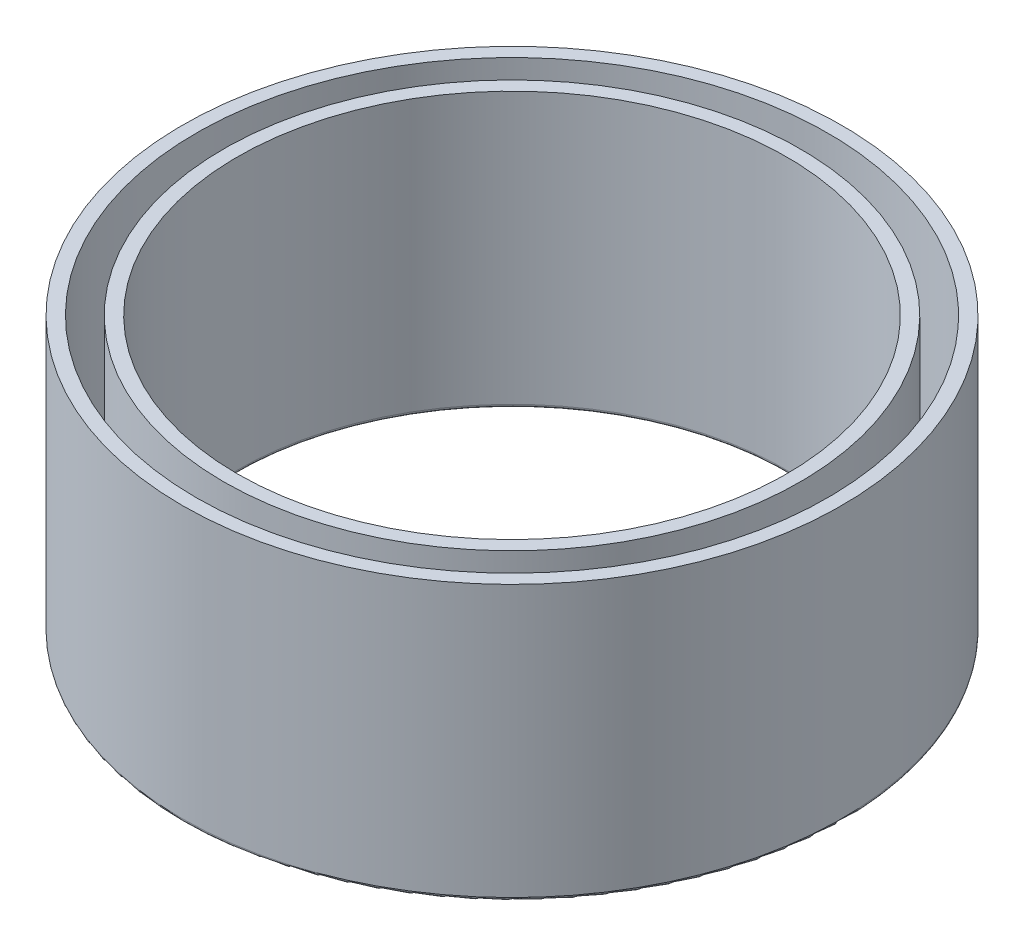
ISO-10303-21;
HEADER;
FILE_DESCRIPTION(('STEP AP214'),'2;1');
FILE_NAME('part.step','',(''),(''),'','','');
FILE_SCHEMA(('AUTOMOTIVE_DESIGN { 1 0 10303 214 1 1 1 1 }'));
ENDSEC;
DATA;
#1=APPLICATION_CONTEXT('core data for automotive mechanical design processes');
#2=APPLICATION_PROTOCOL_DEFINITION('international standard','automotive_design',2000,#1);
#3=PRODUCT_CONTEXT('',#1,'mechanical');
#4=PRODUCT('Part','Part','',(#3));
#5=PRODUCT_RELATED_PRODUCT_CATEGORY('part','',(#4));
#6=PRODUCT_DEFINITION_FORMATION('','',#4);
#7=PRODUCT_DEFINITION_CONTEXT('part definition',#1,'design');
#8=PRODUCT_DEFINITION('design','',#6,#7);
#9=PRODUCT_DEFINITION_SHAPE('','',#8);
#10=(LENGTH_UNIT() NAMED_UNIT(*) SI_UNIT(.MILLI.,.METRE.));
#11=(NAMED_UNIT(*) PLANE_ANGLE_UNIT() SI_UNIT($,.RADIAN.));
#12=(NAMED_UNIT(*) SI_UNIT($,.STERADIAN.) SOLID_ANGLE_UNIT());
#13=UNCERTAINTY_MEASURE_WITH_UNIT(LENGTH_MEASURE(1.E-05),#10,'distance_accuracy_value','');
#14=(GEOMETRIC_REPRESENTATION_CONTEXT(3) GLOBAL_UNCERTAINTY_ASSIGNED_CONTEXT((#13)) GLOBAL_UNIT_ASSIGNED_CONTEXT((#10,
#11,#12)) REPRESENTATION_CONTEXT('',''));
#15=CARTESIAN_POINT('',(0.,0.,0.));
#16=DIRECTION('',(0.,0.,1.));
#17=DIRECTION('',(1.,0.,0.));
#18=AXIS2_PLACEMENT_3D('',#15,#16,#17);
#19=CARTESIAN_POINT('',(0.,0.,0.));
#20=DIRECTION('',(0.,1.,0.));
#21=DIRECTION('',(0.,0.,1.));
#22=AXIS2_PLACEMENT_3D('',#19,#20,#21);
#23=PLANE('',#22);
#24=CARTESIAN_POINT('',(0.,0.,0.));
#25=DIRECTION('',(0.,1.,0.));
#26=DIRECTION('',(0.,0.,1.));
#27=AXIS2_PLACEMENT_3D('',#24,#25,#26);
#28=CIRCLE('',#27,20.);
#29=CARTESIAN_POINT('',(0.,0.,20.));
#30=VERTEX_POINT('',#29);
#31=EDGE_CURVE('E60',#30,#30,#28,.T.);
#32=ORIENTED_EDGE('',*,*,#31,.F.);
#33=EDGE_LOOP('',(#32));
#34=FACE_BOUND('',#33,.T.);
#35=CARTESIAN_POINT('',(0.,0.,0.));
#36=DIRECTION('',(0.,1.,0.));
#37=DIRECTION('',(0.,0.,1.));
#38=AXIS2_PLACEMENT_3D('',#35,#36,#37);
#39=CIRCLE('',#38,21.);
#40=CARTESIAN_POINT('',(0.,0.,21.));
#41=VERTEX_POINT('',#40);
#42=EDGE_CURVE('E64',#41,#41,#39,.T.);
#43=ORIENTED_EDGE('',*,*,#42,.T.);
#44=EDGE_LOOP('',(#43));
#45=FACE_BOUND('',#44,.T.);
#46=ADVANCED_FACE('F37',(#34,#45),#23,.T.);
#47=CARTESIAN_POINT('',(0.,-20.,0.));
#48=DIRECTION('',(0.,1.,0.));
#49=DIRECTION('',(0.,0.,1.));
#50=AXIS2_PLACEMENT_3D('',#47,#48,#49);
#51=CYLINDRICAL_SURFACE('',#50,24.);
#52=CARTESIAN_POINT('',(0.,-19.75,0.));
#53=DIRECTION('',(0.,1.,0.));
#54=DIRECTION('',(0.,0.,1.));
#55=AXIS2_PLACEMENT_3D('',#52,#53,#54);
#56=CIRCLE('',#55,24.);
#57=CARTESIAN_POINT('',(0.,-19.75,24.));
#58=VERTEX_POINT('',#57);
#59=EDGE_CURVE('E44',#58,#58,#56,.T.);
#60=ORIENTED_EDGE('',*,*,#59,.T.);
#61=EDGE_LOOP('',(#60));
#62=FACE_BOUND('',#61,.T.);
#63=CARTESIAN_POINT('',(0.,0.,0.));
#64=DIRECTION('',(0.,1.,0.));
#65=DIRECTION('',(0.,0.,1.));
#66=AXIS2_PLACEMENT_3D('',#63,#64,#65);
#67=CIRCLE('',#66,24.);
#68=CARTESIAN_POINT('',(0.,0.,24.));
#69=VERTEX_POINT('',#68);
#70=EDGE_CURVE('E57',#69,#69,#67,.T.);
#71=ORIENTED_EDGE('',*,*,#70,.F.);
#72=EDGE_LOOP('',(#71));
#73=FACE_BOUND('',#72,.T.);
#74=ADVANCED_FACE('F92',(#62,#73),#51,.T.);
#75=CARTESIAN_POINT('',(0.,-20.,0.));
#76=DIRECTION('',(0.,1.,0.));
#77=DIRECTION('',(0.,0.,1.));
#78=AXIS2_PLACEMENT_3D('',#75,#76,#77);
#79=PLANE('',#78);
#80=CARTESIAN_POINT('',(0.,-20.,0.));
#81=DIRECTION('',(0.,1.,0.));
#82=DIRECTION('',(0.,0.,1.));
#83=AXIS2_PLACEMENT_3D('',#80,#81,#82);
#84=CIRCLE('',#83,23.75);
#85=CARTESIAN_POINT('',(0.,-20.,23.75));
#86=VERTEX_POINT('',#85);
#87=EDGE_CURVE('E10',#86,#86,#84,.F.);
#88=ORIENTED_EDGE('',*,*,#87,.T.);
#89=EDGE_LOOP('',(#88));
#90=FACE_BOUND('',#89,.T.);
#91=CARTESIAN_POINT('',(0.,-20.,0.));
#92=DIRECTION('',(0.,1.,0.));
#93=DIRECTION('',(0.,0.,1.));
#94=AXIS2_PLACEMENT_3D('',#91,#92,#93);
#95=CIRCLE('',#94,20.25);
#96=CARTESIAN_POINT('',(0.,-20.,20.25));
#97=VERTEX_POINT('',#96);
#98=EDGE_CURVE('E52',#97,#97,#95,.T.);
#99=ORIENTED_EDGE('',*,*,#98,.T.);
#100=EDGE_LOOP('',(#99));
#101=FACE_BOUND('',#100,.T.);
#102=ADVANCED_FACE('F88',(#90,#101),#79,.F.);
#103=CARTESIAN_POINT('',(0.,0.,0.));
#104=DIRECTION('',(0.,1.,0.));
#105=DIRECTION('',(0.,0.,1.));
#106=AXIS2_PLACEMENT_3D('',#103,#104,#105);
#107=CIRCLE('',#106,23.);
#108=CARTESIAN_POINT('',(0.,0.,23.));
#109=VERTEX_POINT('',#108);
#110=EDGE_CURVE('E68',#109,#109,#107,.T.);
#111=ORIENTED_EDGE('',*,*,#110,.F.);
#112=EDGE_LOOP('',(#111));
#113=FACE_BOUND('',#112,.T.);
#114=ORIENTED_EDGE('',*,*,#70,.T.);
#115=EDGE_LOOP('',(#114));
#116=FACE_BOUND('',#115,.T.);
#117=ADVANCED_FACE('F85',(#113,#116),#23,.T.);
#118=CARTESIAN_POINT('',(0.,-20.,0.));
#119=DIRECTION('',(0.,1.,0.));
#120=DIRECTION('',(0.,0.,1.));
#121=AXIS2_PLACEMENT_3D('',#118,#119,#120);
#122=CYLINDRICAL_SURFACE('',#121,20.);
#123=CARTESIAN_POINT('',(0.,-19.75,0.));
#124=DIRECTION('',(0.,1.,0.));
#125=DIRECTION('',(0.,0.,1.));
#126=AXIS2_PLACEMENT_3D('',#123,#124,#125);
#127=CIRCLE('',#126,20.);
#128=CARTESIAN_POINT('',(0.,-19.75,20.));
#129=VERTEX_POINT('',#128);
#130=EDGE_CURVE('E48',#129,#129,#127,.F.);
#131=ORIENTED_EDGE('',*,*,#130,.T.);
#132=EDGE_LOOP('',(#131));
#133=FACE_BOUND('',#132,.T.);
#134=ORIENTED_EDGE('',*,*,#31,.T.);
#135=EDGE_LOOP('',(#134));
#136=FACE_BOUND('',#135,.T.);
#137=ADVANCED_FACE('F81',(#133,#136),#122,.F.);
#138=CARTESIAN_POINT('',(0.,-20.,0.));
#139=DIRECTION('',(0.,1.,0.));
#140=DIRECTION('',(0.,0.,1.));
#141=AXIS2_PLACEMENT_3D('',#138,#139,#140);
#142=CYLINDRICAL_SURFACE('',#141,23.);
#143=CARTESIAN_POINT('',(0.,-19.,0.));
#144=DIRECTION('',(0.,1.,0.));
#145=DIRECTION('',(0.,0.,1.));
#146=AXIS2_PLACEMENT_3D('',#143,#144,#145);
#147=CIRCLE('',#146,23.);
#148=CARTESIAN_POINT('',(0.,-19.,23.));
#149=VERTEX_POINT('',#148);
#150=EDGE_CURVE('E63',#149,#149,#147,.T.);
#151=ORIENTED_EDGE('',*,*,#150,.F.);
#152=EDGE_LOOP('',(#151));
#153=FACE_BOUND('',#152,.T.);
#154=ORIENTED_EDGE('',*,*,#110,.T.);
#155=EDGE_LOOP('',(#154));
#156=FACE_BOUND('',#155,.T.);
#157=ADVANCED_FACE('F78',(#153,#156),#142,.F.);
#158=CARTESIAN_POINT('',(0.,-19.,0.));
#159=DIRECTION('',(0.,1.,0.));
#160=DIRECTION('',(0.,0.,1.));
#161=AXIS2_PLACEMENT_3D('',#158,#159,#160);
#162=PLANE('',#161);
#163=CARTESIAN_POINT('',(0.,-19.,0.));
#164=DIRECTION('',(0.,1.,0.));
#165=DIRECTION('',(0.,0.,1.));
#166=AXIS2_PLACEMENT_3D('',#163,#164,#165);
#167=CIRCLE('',#166,21.);
#168=CARTESIAN_POINT('',(0.,-19.,21.));
#169=VERTEX_POINT('',#168);
#170=EDGE_CURVE('E67',#169,#169,#167,.T.);
#171=ORIENTED_EDGE('',*,*,#170,.F.);
#172=EDGE_LOOP('',(#171));
#173=FACE_BOUND('',#172,.T.);
#174=ORIENTED_EDGE('',*,*,#150,.T.);
#175=EDGE_LOOP('',(#174));
#176=FACE_BOUND('',#175,.T.);
#177=ADVANCED_FACE('F76',(#173,#176),#162,.T.);
#178=CARTESIAN_POINT('',(0.,-20.,0.));
#179=DIRECTION('',(0.,1.,0.));
#180=DIRECTION('',(0.,0.,1.));
#181=AXIS2_PLACEMENT_3D('',#178,#179,#180);
#182=CYLINDRICAL_SURFACE('',#181,21.);
#183=ORIENTED_EDGE('',*,*,#170,.T.);
#184=EDGE_LOOP('',(#183));
#185=FACE_BOUND('',#184,.T.);
#186=ORIENTED_EDGE('',*,*,#42,.F.);
#187=EDGE_LOOP('',(#186));
#188=FACE_BOUND('',#187,.T.);
#189=ADVANCED_FACE('F103',(#185,#188),#182,.T.);
#190=CARTESIAN_POINT('',(0.,-19.75,0.));
#191=DIRECTION('',(0.,1.,0.));
#192=DIRECTION('',(0.,0.,1.));
#193=AXIS2_PLACEMENT_3D('',#190,#191,#192);
#194=TOROIDAL_SURFACE('',#193,20.25,0.25);
#195=ORIENTED_EDGE('',*,*,#130,.F.);
#196=EDGE_LOOP('',(#195));
#197=FACE_BOUND('',#196,.T.);
#198=ORIENTED_EDGE('',*,*,#98,.F.);
#199=EDGE_LOOP('',(#198));
#200=FACE_BOUND('',#199,.T.);
#201=ADVANCED_FACE('F101',(#197,#200),#194,.T.);
#202=CARTESIAN_POINT('',(0.,-19.75,0.));
#203=DIRECTION('',(0.,1.,0.));
#204=DIRECTION('',(0.,0.,1.));
#205=AXIS2_PLACEMENT_3D('',#202,#203,#204);
#206=TOROIDAL_SURFACE('',#205,23.75,0.25);
#207=ORIENTED_EDGE('',*,*,#87,.F.);
#208=EDGE_LOOP('',(#207));
#209=FACE_BOUND('',#208,.T.);
#210=ORIENTED_EDGE('',*,*,#59,.F.);
#211=EDGE_LOOP('',(#210));
#212=FACE_BOUND('',#211,.T.);
#213=ADVANCED_FACE('F39',(#209,#212),#206,.T.);
#214=CLOSED_SHELL('',(#46,#74,#102,#117,#137,#157,#177,#189,#201,#213));
#215=MANIFOLD_SOLID_BREP('B2',#214);
#216=ADVANCED_BREP_SHAPE_REPRESENTATION('',(#18,#215),#14);
#217=SHAPE_DEFINITION_REPRESENTATION(#9,#216);
ENDSEC;
END-ISO-10303-21;
